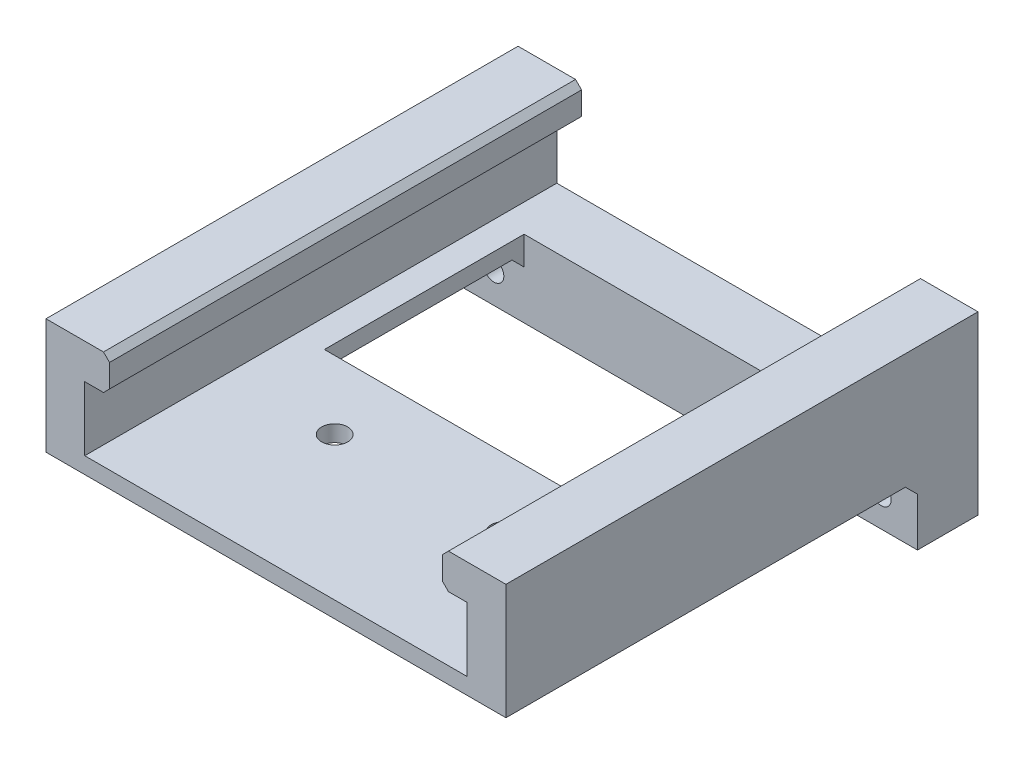
ISO-10303-21;
HEADER;
FILE_DESCRIPTION(('STEP AP214'),'2;1');
FILE_NAME('part.step','',(''),(''),'','','');
FILE_SCHEMA(('AUTOMOTIVE_DESIGN { 1 0 10303 214 1 1 1 1 }'));
ENDSEC;
DATA;
#1=APPLICATION_CONTEXT('core data for automotive mechanical design processes');
#2=APPLICATION_PROTOCOL_DEFINITION('international standard','automotive_design',2000,#1);
#3=PRODUCT_CONTEXT('',#1,'mechanical');
#4=PRODUCT('Part','Part','',(#3));
#5=PRODUCT_RELATED_PRODUCT_CATEGORY('part','',(#4));
#6=PRODUCT_DEFINITION_FORMATION('','',#4);
#7=PRODUCT_DEFINITION_CONTEXT('part definition',#1,'design');
#8=PRODUCT_DEFINITION('design','',#6,#7);
#9=PRODUCT_DEFINITION_SHAPE('','',#8);
#10=(LENGTH_UNIT() NAMED_UNIT(*) SI_UNIT(.MILLI.,.METRE.));
#11=(NAMED_UNIT(*) PLANE_ANGLE_UNIT() SI_UNIT($,.RADIAN.));
#12=(NAMED_UNIT(*) SI_UNIT($,.STERADIAN.) SOLID_ANGLE_UNIT());
#13=UNCERTAINTY_MEASURE_WITH_UNIT(LENGTH_MEASURE(1.E-05),#10,'distance_accuracy_value','');
#14=(GEOMETRIC_REPRESENTATION_CONTEXT(3) GLOBAL_UNCERTAINTY_ASSIGNED_CONTEXT((#13)) GLOBAL_UNIT_ASSIGNED_CONTEXT((#10,
#11,#12)) REPRESENTATION_CONTEXT('',''));
#15=CARTESIAN_POINT('',(0.,0.,0.));
#16=DIRECTION('',(0.,0.,1.));
#17=DIRECTION('',(1.,0.,0.));
#18=AXIS2_PLACEMENT_3D('',#15,#16,#17);
#19=CARTESIAN_POINT('',(-38.,0.,39.));
#20=DIRECTION('',(0.,1.,0.));
#21=DIRECTION('',(0.,0.,1.));
#22=AXIS2_PLACEMENT_3D('',#19,#20,#21);
#23=PLANE('',#22);
#24=CARTESIAN_POINT('',(-14.,0.,15.3));
#25=DIRECTION('',(0.,-1.,0.));
#26=DIRECTION('',(0.,0.,-1.));
#27=AXIS2_PLACEMENT_3D('',#24,#25,#26);
#28=CIRCLE('',#27,2.15);
#29=CARTESIAN_POINT('',(-14.,0.,13.15));
#30=VERTEX_POINT('',#29);
#31=EDGE_CURVE('E326',#30,#30,#28,.T.);
#32=ORIENTED_EDGE('',*,*,#31,.F.);
#33=EDGE_LOOP('',(#32));
#34=FACE_BOUND('',#33,.T.);
#35=CARTESIAN_POINT('',(14.,0.,15.3));
#36=DIRECTION('',(0.,-1.,0.));
#37=DIRECTION('',(0.,0.,-1.));
#38=AXIS2_PLACEMENT_3D('',#35,#36,#37);
#39=CIRCLE('',#38,2.15);
#40=CARTESIAN_POINT('',(14.,0.,13.15));
#41=VERTEX_POINT('',#40);
#42=EDGE_CURVE('E317',#41,#41,#39,.T.);
#43=ORIENTED_EDGE('',*,*,#42,.F.);
#44=EDGE_LOOP('',(#43));
#45=FACE_BOUND('',#44,.T.);
#46=DIRECTION('',(0.,0.,-1.));
#47=VECTOR('',#46,1.);
#48=CARTESIAN_POINT('',(-38.,0.,39.));
#49=LINE('',#48,#47);
#50=CARTESIAN_POINT('',(-38.,0.,39.));
#51=VERTEX_POINT('',#50);
#52=CARTESIAN_POINT('',(-38.,0.,-27.));
#53=VERTEX_POINT('',#52);
#54=EDGE_CURVE('E436',#51,#53,#49,.T.);
#55=ORIENTED_EDGE('',*,*,#54,.T.);
#56=DIRECTION('',(1.,0.,0.));
#57=VECTOR('',#56,1.);
#58=CARTESIAN_POINT('',(-27.,0.,-27.));
#59=LINE('',#58,#57);
#60=CARTESIAN_POINT('',(-27.,0.,-27.));
#61=VERTEX_POINT('',#60);
#62=EDGE_CURVE('E74',#53,#61,#59,.T.);
#63=ORIENTED_EDGE('',*,*,#62,.T.);
#64=DIRECTION('',(0.,0.,-1.));
#65=VECTOR('',#64,1.);
#66=CARTESIAN_POINT('',(-27.,0.,-29.));
#67=LINE('',#66,#65);
#68=CARTESIAN_POINT('',(-27.,0.,4.));
#69=VERTEX_POINT('',#68);
#70=EDGE_CURVE('E264',#69,#61,#67,.T.);
#71=ORIENTED_EDGE('',*,*,#70,.F.);
#72=DIRECTION('',(-1.,0.,0.));
#73=VECTOR('',#72,1.);
#74=CARTESIAN_POINT('',(-27.,0.,4.));
#75=LINE('',#74,#73);
#76=CARTESIAN_POINT('',(27.,0.,4.));
#77=VERTEX_POINT('',#76);
#78=EDGE_CURVE('E285',#77,#69,#75,.T.);
#79=ORIENTED_EDGE('',*,*,#78,.F.);
#80=DIRECTION('',(0.,0.,1.));
#81=VECTOR('',#80,1.);
#82=CARTESIAN_POINT('',(27.,0.,-29.));
#83=LINE('',#82,#81);
#84=CARTESIAN_POINT('',(27.,0.,-27.));
#85=VERTEX_POINT('',#84);
#86=EDGE_CURVE('E258',#85,#77,#83,.T.);
#87=ORIENTED_EDGE('',*,*,#86,.F.);
#88=DIRECTION('',(1.,0.,0.));
#89=VECTOR('',#88,1.);
#90=CARTESIAN_POINT('',(38.,0.,-27.));
#91=LINE('',#90,#89);
#92=CARTESIAN_POINT('',(38.,0.,-27.));
#93=VERTEX_POINT('',#92);
#94=EDGE_CURVE('E459',#85,#93,#91,.T.);
#95=ORIENTED_EDGE('',*,*,#94,.T.);
#96=DIRECTION('',(0.,0.,-1.));
#97=VECTOR('',#96,1.);
#98=CARTESIAN_POINT('',(38.,0.,39.));
#99=LINE('',#98,#97);
#100=CARTESIAN_POINT('',(38.,0.,39.));
#101=VERTEX_POINT('',#100);
#102=EDGE_CURVE('E426',#101,#93,#99,.T.);
#103=ORIENTED_EDGE('',*,*,#102,.F.);
#104=DIRECTION('',(1.,0.,0.));
#105=VECTOR('',#104,1.);
#106=CARTESIAN_POINT('',(-38.,0.,39.));
#107=LINE('',#106,#105);
#108=EDGE_CURVE('E344',#51,#101,#107,.T.);
#109=ORIENTED_EDGE('',*,*,#108,.F.);
#110=EDGE_LOOP('',(#55,#63,#71,#79,#87,#95,#103,#109));
#111=FACE_BOUND('',#110,.T.);
#112=ADVANCED_FACE('F55',(#34,#45,#111),#23,.F.);
#113=CARTESIAN_POINT('',(-27.5,19.1,39.));
#114=DIRECTION('',(-1.,0.,0.));
#115=DIRECTION('',(0.,-1.,0.));
#116=AXIS2_PLACEMENT_3D('',#113,#114,#115);
#117=PLANE('',#116);
#118=DIRECTION('',(0.,1.,0.));
#119=VECTOR('',#118,1.);
#120=CARTESIAN_POINT('',(-27.5,19.1,-39.));
#121=LINE('',#120,#119);
#122=CARTESIAN_POINT('',(-27.5,14.3,-39.));
#123=VERTEX_POINT('',#122);
#124=CARTESIAN_POINT('',(-27.5,18.1,-39.));
#125=VERTEX_POINT('',#124);
#126=EDGE_CURVE('E334',#123,#125,#121,.T.);
#127=ORIENTED_EDGE('',*,*,#126,.T.);
#128=DIRECTION('',(0.,0.,1.));
#129=VECTOR('',#128,1.);
#130=CARTESIAN_POINT('',(-27.5,18.1,39.));
#131=LINE('',#130,#129);
#132=CARTESIAN_POINT('',(-27.5,18.1,39.));
#133=VERTEX_POINT('',#132);
#134=EDGE_CURVE('E536',#125,#133,#131,.T.);
#135=ORIENTED_EDGE('',*,*,#134,.T.);
#136=DIRECTION('',(0.,1.,0.));
#137=VECTOR('',#136,1.);
#138=CARTESIAN_POINT('',(-27.5,19.1,39.));
#139=LINE('',#138,#137);
#140=CARTESIAN_POINT('',(-27.5,14.3,39.));
#141=VERTEX_POINT('',#140);
#142=EDGE_CURVE('E335',#141,#133,#139,.T.);
#143=ORIENTED_EDGE('',*,*,#142,.F.);
#144=DIRECTION('',(0.,0.,-1.));
#145=VECTOR('',#144,1.);
#146=CARTESIAN_POINT('',(-27.5,14.3,39.));
#147=LINE('',#146,#145);
#148=EDGE_CURVE('E534',#141,#123,#147,.T.);
#149=ORIENTED_EDGE('',*,*,#148,.T.);
#150=EDGE_LOOP('',(#127,#135,#143,#149));
#151=FACE_BOUND('',#150,.T.);
#152=ADVANCED_FACE('F556',(#151),#117,.F.);
#153=CARTESIAN_POINT('',(-27.5,19.1,39.));
#154=DIRECTION('',(0.,-1.,0.));
#155=DIRECTION('',(0.,0.,-1.));
#156=AXIS2_PLACEMENT_3D('',#153,#154,#155);
#157=PLANE('',#156);
#158=DIRECTION('',(-1.,0.,0.));
#159=VECTOR('',#158,1.);
#160=CARTESIAN_POINT('',(-27.5,19.1,39.));
#161=LINE('',#160,#159);
#162=CARTESIAN_POINT('',(-28.5,19.1,39.));
#163=VERTEX_POINT('',#162);
#164=CARTESIAN_POINT('',(-38.,19.1,39.));
#165=VERTEX_POINT('',#164);
#166=EDGE_CURVE('E338',#163,#165,#161,.T.);
#167=ORIENTED_EDGE('',*,*,#166,.F.);
#168=DIRECTION('',(0.,0.,-1.));
#169=VECTOR('',#168,1.);
#170=CARTESIAN_POINT('',(-28.5,19.1,39.));
#171=LINE('',#170,#169);
#172=CARTESIAN_POINT('',(-28.5,19.1,-39.));
#173=VERTEX_POINT('',#172);
#174=EDGE_CURVE('E530',#163,#173,#171,.T.);
#175=ORIENTED_EDGE('',*,*,#174,.T.);
#176=DIRECTION('',(-1.,0.,0.));
#177=VECTOR('',#176,1.);
#178=CARTESIAN_POINT('',(-27.5,19.1,-39.));
#179=LINE('',#178,#177);
#180=CARTESIAN_POINT('',(-38.,19.1,-39.));
#181=VERTEX_POINT('',#180);
#182=EDGE_CURVE('E375',#173,#181,#179,.T.);
#183=ORIENTED_EDGE('',*,*,#182,.T.);
#184=DIRECTION('',(0.,0.,-1.));
#185=VECTOR('',#184,1.);
#186=CARTESIAN_POINT('',(-38.,19.1,39.));
#187=LINE('',#186,#185);
#188=EDGE_CURVE('E441',#165,#181,#187,.T.);
#189=ORIENTED_EDGE('',*,*,#188,.F.);
#190=EDGE_LOOP('',(#167,#175,#183,#189));
#191=FACE_BOUND('',#190,.T.);
#192=ADVANCED_FACE('F565',(#191),#157,.F.);
#193=CARTESIAN_POINT('',(-38.,19.1,39.));
#194=DIRECTION('',(1.,0.,0.));
#195=DIRECTION('',(0.,0.,-1.));
#196=AXIS2_PLACEMENT_3D('',#193,#194,#195);
#197=PLANE('',#196);
#198=DIRECTION('',(0.,-1.,0.));
#199=VECTOR('',#198,1.);
#200=CARTESIAN_POINT('',(-38.,19.1,-39.));
#201=LINE('',#200,#199);
#202=CARTESIAN_POINT('',(-38.,-10.,-39.));
#203=VERTEX_POINT('',#202);
#204=EDGE_CURVE('E378',#181,#203,#201,.T.);
#205=ORIENTED_EDGE('',*,*,#204,.T.);
#206=DIRECTION('',(0.,0.,-1.));
#207=VECTOR('',#206,1.);
#208=CARTESIAN_POINT('',(-38.,-10.,-29.));
#209=LINE('',#208,#207);
#210=CARTESIAN_POINT('',(-38.,-10.,-29.));
#211=VERTEX_POINT('',#210);
#212=EDGE_CURVE('E309',#211,#203,#209,.T.);
#213=ORIENTED_EDGE('',*,*,#212,.F.);
#214=DIRECTION('',(0.,1.,0.));
#215=VECTOR('',#214,1.);
#216=CARTESIAN_POINT('',(-38.,-10.,-29.));
#217=LINE('',#216,#215);
#218=CARTESIAN_POINT('',(-38.,-2.00000000000002,-29.));
#219=VERTEX_POINT('',#218);
#220=EDGE_CURVE('E316',#211,#219,#217,.T.);
#221=ORIENTED_EDGE('',*,*,#220,.T.);
#222=DIRECTION('',(0.,-0.707106781186551,-0.707106781186544));
#223=VECTOR('',#222,1.);
#224=CARTESIAN_POINT('',(-38.,42.5500000000001,15.5499999999997));
#225=LINE('',#224,#223);
#226=EDGE_CURVE('E83',#219,#53,#225,.F.);
#227=ORIENTED_EDGE('',*,*,#226,.T.);
#228=ORIENTED_EDGE('',*,*,#54,.F.);
#229=DIRECTION('',(0.,-1.,0.));
#230=VECTOR('',#229,1.);
#231=CARTESIAN_POINT('',(-38.,19.1,39.));
#232=LINE('',#231,#230);
#233=EDGE_CURVE('E341',#165,#51,#232,.T.);
#234=ORIENTED_EDGE('',*,*,#233,.F.);
#235=ORIENTED_EDGE('',*,*,#188,.T.);
#236=EDGE_LOOP('',(#205,#213,#221,#227,#228,#234,#235));
#237=FACE_BOUND('',#236,.T.);
#238=ADVANCED_FACE('F570',(#237),#197,.F.);
#239=CARTESIAN_POINT('',(38.,19.1,39.));
#240=DIRECTION('',(-1.,0.,0.));
#241=DIRECTION('',(0.,0.,1.));
#242=AXIS2_PLACEMENT_3D('',#239,#240,#241);
#243=PLANE('',#242);
#244=DIRECTION('',(0.,1.,0.));
#245=VECTOR('',#244,1.);
#246=CARTESIAN_POINT('',(38.,19.1,-39.));
#247=LINE('',#246,#245);
#248=CARTESIAN_POINT('',(38.,-10.,-39.));
#249=VERTEX_POINT('',#248);
#250=CARTESIAN_POINT('',(38.,19.1,-39.));
#251=VERTEX_POINT('',#250);
#252=EDGE_CURVE('E381',#249,#251,#247,.T.);
#253=ORIENTED_EDGE('',*,*,#252,.T.);
#254=DIRECTION('',(0.,0.,-1.));
#255=VECTOR('',#254,1.);
#256=CARTESIAN_POINT('',(38.,19.1,39.));
#257=LINE('',#256,#255);
#258=CARTESIAN_POINT('',(38.,19.1,39.));
#259=VERTEX_POINT('',#258);
#260=EDGE_CURVE('E422',#259,#251,#257,.T.);
#261=ORIENTED_EDGE('',*,*,#260,.F.);
#262=DIRECTION('',(0.,1.,0.));
#263=VECTOR('',#262,1.);
#264=CARTESIAN_POINT('',(38.,19.1,39.));
#265=LINE('',#264,#263);
#266=EDGE_CURVE('E347',#101,#259,#265,.T.);
#267=ORIENTED_EDGE('',*,*,#266,.F.);
#268=ORIENTED_EDGE('',*,*,#102,.T.);
#269=DIRECTION('',(0.,0.707106781186551,0.707106781186544));
#270=VECTOR('',#269,1.);
#271=CARTESIAN_POINT('',(38.,42.5500000000001,15.5499999999997));
#272=LINE('',#271,#270);
#273=CARTESIAN_POINT('',(38.,-2.00000000000002,-29.));
#274=VERTEX_POINT('',#273);
#275=EDGE_CURVE('E13',#93,#274,#272,.F.);
#276=ORIENTED_EDGE('',*,*,#275,.T.);
#277=DIRECTION('',(0.,1.,0.));
#278=VECTOR('',#277,1.);
#279=CARTESIAN_POINT('',(38.,-10.,-29.));
#280=LINE('',#279,#278);
#281=CARTESIAN_POINT('',(38.,-10.,-29.));
#282=VERTEX_POINT('',#281);
#283=EDGE_CURVE('E322',#282,#274,#280,.T.);
#284=ORIENTED_EDGE('',*,*,#283,.F.);
#285=DIRECTION('',(0.,0.,1.));
#286=VECTOR('',#285,1.);
#287=CARTESIAN_POINT('',(38.,-10.,-29.));
#288=LINE('',#287,#286);
#289=EDGE_CURVE('E273',#249,#282,#288,.T.);
#290=ORIENTED_EDGE('',*,*,#289,.F.);
#291=EDGE_LOOP('',(#253,#261,#267,#268,#276,#284,#290));
#292=FACE_BOUND('',#291,.T.);
#293=ADVANCED_FACE('F477',(#292),#243,.F.);
#294=CARTESIAN_POINT('',(27.5,19.1,39.));
#295=DIRECTION('',(0.,-1.,0.));
#296=DIRECTION('',(0.,0.,-1.));
#297=AXIS2_PLACEMENT_3D('',#294,#295,#296);
#298=PLANE('',#297);
#299=DIRECTION('',(-1.,0.,0.));
#300=VECTOR('',#299,1.);
#301=CARTESIAN_POINT('',(27.5,19.1,-39.));
#302=LINE('',#301,#300);
#303=CARTESIAN_POINT('',(28.5,19.1,-39.));
#304=VERTEX_POINT('',#303);
#305=EDGE_CURVE('E384',#251,#304,#302,.T.);
#306=ORIENTED_EDGE('',*,*,#305,.T.);
#307=DIRECTION('',(0.,0.,1.));
#308=VECTOR('',#307,1.);
#309=CARTESIAN_POINT('',(28.5,19.1,39.));
#310=LINE('',#309,#308);
#311=CARTESIAN_POINT('',(28.5,19.1,39.));
#312=VERTEX_POINT('',#311);
#313=EDGE_CURVE('E527',#304,#312,#310,.T.);
#314=ORIENTED_EDGE('',*,*,#313,.T.);
#315=DIRECTION('',(-1.,0.,0.));
#316=VECTOR('',#315,1.);
#317=CARTESIAN_POINT('',(27.5,19.1,39.));
#318=LINE('',#317,#316);
#319=EDGE_CURVE('E350',#259,#312,#318,.T.);
#320=ORIENTED_EDGE('',*,*,#319,.F.);
#321=ORIENTED_EDGE('',*,*,#260,.T.);
#322=EDGE_LOOP('',(#306,#314,#320,#321));
#323=FACE_BOUND('',#322,.T.);
#324=ADVANCED_FACE('F492',(#323),#298,.F.);
#325=CARTESIAN_POINT('',(27.5,19.1,39.));
#326=DIRECTION('',(1.,0.,0.));
#327=DIRECTION('',(0.,1.,0.));
#328=AXIS2_PLACEMENT_3D('',#325,#326,#327);
#329=PLANE('',#328);
#330=DIRECTION('',(0.,-1.,0.));
#331=VECTOR('',#330,1.);
#332=CARTESIAN_POINT('',(27.5,19.1,-39.));
#333=LINE('',#332,#331);
#334=CARTESIAN_POINT('',(27.5,18.1,-39.));
#335=VERTEX_POINT('',#334);
#336=CARTESIAN_POINT('',(27.5,14.3,-39.));
#337=VERTEX_POINT('',#336);
#338=EDGE_CURVE('E388',#335,#337,#333,.T.);
#339=ORIENTED_EDGE('',*,*,#338,.T.);
#340=DIRECTION('',(0.,0.,1.));
#341=VECTOR('',#340,1.);
#342=CARTESIAN_POINT('',(27.5,14.3,39.));
#343=LINE('',#342,#341);
#344=CARTESIAN_POINT('',(27.5,14.3,39.));
#345=VERTEX_POINT('',#344);
#346=EDGE_CURVE('E515',#337,#345,#343,.T.);
#347=ORIENTED_EDGE('',*,*,#346,.T.);
#348=DIRECTION('',(0.,-1.,0.));
#349=VECTOR('',#348,1.);
#350=CARTESIAN_POINT('',(27.5,19.1,39.));
#351=LINE('',#350,#349);
#352=CARTESIAN_POINT('',(27.5,18.1,39.));
#353=VERTEX_POINT('',#352);
#354=EDGE_CURVE('E353',#353,#345,#351,.T.);
#355=ORIENTED_EDGE('',*,*,#354,.F.);
#356=DIRECTION('',(0.,0.,-1.));
#357=VECTOR('',#356,1.);
#358=CARTESIAN_POINT('',(27.5,18.1,39.));
#359=LINE('',#358,#357);
#360=EDGE_CURVE('E506',#353,#335,#359,.T.);
#361=ORIENTED_EDGE('',*,*,#360,.T.);
#362=EDGE_LOOP('',(#339,#347,#355,#361));
#363=FACE_BOUND('',#362,.T.);
#364=ADVANCED_FACE('F575',(#363),#329,.F.);
#365=CARTESIAN_POINT('',(27.5,13.3,39.));
#366=DIRECTION('',(0.,1.,0.));
#367=DIRECTION('',(0.,0.,1.));
#368=AXIS2_PLACEMENT_3D('',#365,#366,#367);
#369=PLANE('',#368);
#370=DIRECTION('',(1.,0.,0.));
#371=VECTOR('',#370,1.);
#372=CARTESIAN_POINT('',(27.5,13.3,39.));
#373=LINE('',#372,#371);
#374=CARTESIAN_POINT('',(28.5,13.3,39.));
#375=VERTEX_POINT('',#374);
#376=CARTESIAN_POINT('',(31.6,13.3,39.));
#377=VERTEX_POINT('',#376);
#378=EDGE_CURVE('E357',#375,#377,#373,.T.);
#379=ORIENTED_EDGE('',*,*,#378,.F.);
#380=DIRECTION('',(0.,0.,-1.));
#381=VECTOR('',#380,1.);
#382=CARTESIAN_POINT('',(28.5,13.3,39.));
#383=LINE('',#382,#381);
#384=CARTESIAN_POINT('',(28.5,13.3,-39.));
#385=VERTEX_POINT('',#384);
#386=EDGE_CURVE('E583',#375,#385,#383,.T.);
#387=ORIENTED_EDGE('',*,*,#386,.T.);
#388=DIRECTION('',(1.,0.,0.));
#389=VECTOR('',#388,1.);
#390=CARTESIAN_POINT('',(27.5,13.3,-39.));
#391=LINE('',#390,#389);
#392=CARTESIAN_POINT('',(31.6,13.3,-39.));
#393=VERTEX_POINT('',#392);
#394=EDGE_CURVE('E392',#385,#393,#391,.T.);
#395=ORIENTED_EDGE('',*,*,#394,.T.);
#396=DIRECTION('',(0.,0.,-1.));
#397=VECTOR('',#396,1.);
#398=CARTESIAN_POINT('',(31.6,13.3,39.));
#399=LINE('',#398,#397);
#400=EDGE_CURVE('E418',#377,#393,#399,.T.);
#401=ORIENTED_EDGE('',*,*,#400,.F.);
#402=EDGE_LOOP('',(#379,#387,#395,#401));
#403=FACE_BOUND('',#402,.T.);
#404=ADVANCED_FACE('F691',(#403),#369,.F.);
#405=CARTESIAN_POINT('',(31.6,13.3,39.));
#406=DIRECTION('',(1.,0.,0.));
#407=DIRECTION('',(0.,1.,0.));
#408=AXIS2_PLACEMENT_3D('',#405,#406,#407);
#409=PLANE('',#408);
#410=DIRECTION('',(0.,-1.,0.));
#411=VECTOR('',#410,1.);
#412=CARTESIAN_POINT('',(31.6,13.3,-39.));
#413=LINE('',#412,#411);
#414=CARTESIAN_POINT('',(31.6,2.7,-39.));
#415=VERTEX_POINT('',#414);
#416=EDGE_CURVE('E395',#393,#415,#413,.T.);
#417=ORIENTED_EDGE('',*,*,#416,.T.);
#418=DIRECTION('',(0.,0.,-1.));
#419=VECTOR('',#418,1.);
#420=CARTESIAN_POINT('',(31.6,2.7,39.));
#421=LINE('',#420,#419);
#422=CARTESIAN_POINT('',(31.6,2.7,39.));
#423=VERTEX_POINT('',#422);
#424=EDGE_CURVE('E414',#423,#415,#421,.T.);
#425=ORIENTED_EDGE('',*,*,#424,.F.);
#426=DIRECTION('',(0.,-1.,0.));
#427=VECTOR('',#426,1.);
#428=CARTESIAN_POINT('',(31.6,13.3,39.));
#429=LINE('',#428,#427);
#430=EDGE_CURVE('E360',#377,#423,#429,.T.);
#431=ORIENTED_EDGE('',*,*,#430,.F.);
#432=ORIENTED_EDGE('',*,*,#400,.T.);
#433=EDGE_LOOP('',(#417,#425,#431,#432));
#434=FACE_BOUND('',#433,.T.);
#435=ADVANCED_FACE('F688',(#434),#409,.F.);
#436=CARTESIAN_POINT('',(-31.6,2.7,39.));
#437=DIRECTION('',(0.,-1.,0.));
#438=DIRECTION('',(0.,0.,-1.));
#439=AXIS2_PLACEMENT_3D('',#436,#437,#438);
#440=PLANE('',#439);
#441=DIRECTION('',(-1.,0.,0.));
#442=VECTOR('',#441,1.);
#443=CARTESIAN_POINT('',(-27.,2.7,-29.));
#444=LINE('',#443,#442);
#445=CARTESIAN_POINT('',(27.,2.70000000000001,-29.));
#446=VERTEX_POINT('',#445);
#447=CARTESIAN_POINT('',(-27.,2.70000000000001,-29.));
#448=VERTEX_POINT('',#447);
#449=EDGE_CURVE('E279',#446,#448,#444,.T.);
#450=ORIENTED_EDGE('',*,*,#449,.F.);
#451=DIRECTION('',(0.,0.,-1.));
#452=VECTOR('',#451,1.);
#453=CARTESIAN_POINT('',(27.,2.7,-29.));
#454=LINE('',#453,#452);
#455=CARTESIAN_POINT('',(27.,2.7,4.));
#456=VERTEX_POINT('',#455);
#457=EDGE_CURVE('E255',#456,#446,#454,.T.);
#458=ORIENTED_EDGE('',*,*,#457,.F.);
#459=DIRECTION('',(1.,0.,0.));
#460=VECTOR('',#459,1.);
#461=CARTESIAN_POINT('',(-27.,2.7,4.));
#462=LINE('',#461,#460);
#463=CARTESIAN_POINT('',(-27.,2.7,4.));
#464=VERTEX_POINT('',#463);
#465=EDGE_CURVE('E268',#464,#456,#462,.T.);
#466=ORIENTED_EDGE('',*,*,#465,.F.);
#467=DIRECTION('',(0.,0.,1.));
#468=VECTOR('',#467,1.);
#469=CARTESIAN_POINT('',(-27.,2.7,-29.));
#470=LINE('',#469,#468);
#471=EDGE_CURVE('E288',#448,#464,#470,.T.);
#472=ORIENTED_EDGE('',*,*,#471,.F.);
#473=EDGE_LOOP('',(#450,#458,#466,#472));
#474=FACE_BOUND('',#473,.T.);
#475=CARTESIAN_POINT('',(14.,2.7,15.3));
#476=DIRECTION('',(0.,-1.,0.));
#477=DIRECTION('',(0.,0.,-1.));
#478=AXIS2_PLACEMENT_3D('',#475,#476,#477);
#479=CIRCLE('',#478,2.15);
#480=CARTESIAN_POINT('',(14.,2.7,13.15));
#481=VERTEX_POINT('',#480);
#482=EDGE_CURVE('E321',#481,#481,#479,.T.);
#483=ORIENTED_EDGE('',*,*,#482,.T.);
#484=EDGE_LOOP('',(#483));
#485=FACE_BOUND('',#484,.T.);
#486=CARTESIAN_POINT('',(-14.,2.7,15.3));
#487=DIRECTION('',(0.,-1.,0.));
#488=DIRECTION('',(0.,0.,-1.));
#489=AXIS2_PLACEMENT_3D('',#486,#487,#488);
#490=CIRCLE('',#489,2.15);
#491=CARTESIAN_POINT('',(-14.,2.7,13.15));
#492=VERTEX_POINT('',#491);
#493=EDGE_CURVE('E330',#492,#492,#490,.T.);
#494=ORIENTED_EDGE('',*,*,#493,.T.);
#495=EDGE_LOOP('',(#494));
#496=FACE_BOUND('',#495,.T.);
#497=DIRECTION('',(-1.,0.,0.));
#498=VECTOR('',#497,1.);
#499=CARTESIAN_POINT('',(-31.6,2.7,-39.));
#500=LINE('',#499,#498);
#501=CARTESIAN_POINT('',(-31.6,2.7,-39.));
#502=VERTEX_POINT('',#501);
#503=EDGE_CURVE('E398',#415,#502,#500,.T.);
#504=ORIENTED_EDGE('',*,*,#503,.T.);
#505=DIRECTION('',(0.,0.,-1.));
#506=VECTOR('',#505,1.);
#507=CARTESIAN_POINT('',(-31.6,2.7,39.));
#508=LINE('',#507,#506);
#509=CARTESIAN_POINT('',(-31.6,2.7,39.));
#510=VERTEX_POINT('',#509);
#511=EDGE_CURVE('E410',#510,#502,#508,.T.);
#512=ORIENTED_EDGE('',*,*,#511,.F.);
#513=DIRECTION('',(-1.,0.,0.));
#514=VECTOR('',#513,1.);
#515=CARTESIAN_POINT('',(-31.6,2.7,39.));
#516=LINE('',#515,#514);
#517=EDGE_CURVE('E363',#423,#510,#516,.T.);
#518=ORIENTED_EDGE('',*,*,#517,.F.);
#519=ORIENTED_EDGE('',*,*,#424,.T.);
#520=EDGE_LOOP('',(#504,#512,#518,#519));
#521=FACE_BOUND('',#520,.T.);
#522=ADVANCED_FACE('F276',(#474,#485,#496,#521),#440,.F.);
#523=CARTESIAN_POINT('',(-31.6,13.3,39.));
#524=DIRECTION('',(-1.,0.,0.));
#525=DIRECTION('',(0.,-1.,0.));
#526=AXIS2_PLACEMENT_3D('',#523,#524,#525);
#527=PLANE('',#526);
#528=DIRECTION('',(0.,1.,0.));
#529=VECTOR('',#528,1.);
#530=CARTESIAN_POINT('',(-31.6,13.3,-39.));
#531=LINE('',#530,#529);
#532=CARTESIAN_POINT('',(-31.6,13.3,-39.));
#533=VERTEX_POINT('',#532);
#534=EDGE_CURVE('E401',#502,#533,#531,.T.);
#535=ORIENTED_EDGE('',*,*,#534,.T.);
#536=DIRECTION('',(0.,0.,-1.));
#537=VECTOR('',#536,1.);
#538=CARTESIAN_POINT('',(-31.6,13.3,39.));
#539=LINE('',#538,#537);
#540=CARTESIAN_POINT('',(-31.6,13.3,39.));
#541=VERTEX_POINT('',#540);
#542=EDGE_CURVE('E371',#541,#533,#539,.T.);
#543=ORIENTED_EDGE('',*,*,#542,.F.);
#544=DIRECTION('',(0.,1.,0.));
#545=VECTOR('',#544,1.);
#546=CARTESIAN_POINT('',(-31.6,13.3,39.));
#547=LINE('',#546,#545);
#548=EDGE_CURVE('E366',#510,#541,#547,.T.);
#549=ORIENTED_EDGE('',*,*,#548,.F.);
#550=ORIENTED_EDGE('',*,*,#511,.T.);
#551=EDGE_LOOP('',(#535,#543,#549,#550));
#552=FACE_BOUND('',#551,.T.);
#553=ADVANCED_FACE('F682',(#552),#527,.F.);
#554=CARTESIAN_POINT('',(-27.5,13.3,39.));
#555=DIRECTION('',(0.,1.,0.));
#556=DIRECTION('',(0.,0.,1.));
#557=AXIS2_PLACEMENT_3D('',#554,#555,#556);
#558=PLANE('',#557);
#559=DIRECTION('',(1.,0.,0.));
#560=VECTOR('',#559,1.);
#561=CARTESIAN_POINT('',(-27.5,13.3,-39.));
#562=LINE('',#561,#560);
#563=CARTESIAN_POINT('',(-28.5,13.3,-39.));
#564=VERTEX_POINT('',#563);
#565=EDGE_CURVE('E339',#533,#564,#562,.T.);
#566=ORIENTED_EDGE('',*,*,#565,.T.);
#567=DIRECTION('',(0.,0.,1.));
#568=VECTOR('',#567,1.);
#569=CARTESIAN_POINT('',(-28.5,13.3,39.));
#570=LINE('',#569,#568);
#571=CARTESIAN_POINT('',(-28.5,13.3,39.));
#572=VERTEX_POINT('',#571);
#573=EDGE_CURVE('E437',#564,#572,#570,.T.);
#574=ORIENTED_EDGE('',*,*,#573,.T.);
#575=DIRECTION('',(1.,0.,0.));
#576=VECTOR('',#575,1.);
#577=CARTESIAN_POINT('',(-27.5,13.3,39.));
#578=LINE('',#577,#576);
#579=EDGE_CURVE('E368',#541,#572,#578,.T.);
#580=ORIENTED_EDGE('',*,*,#579,.F.);
#581=ORIENTED_EDGE('',*,*,#542,.T.);
#582=EDGE_LOOP('',(#566,#574,#580,#581));
#583=FACE_BOUND('',#582,.T.);
#584=ADVANCED_FACE('F545',(#583),#558,.F.);
#585=CARTESIAN_POINT('',(0.,0.,39.));
#586=DIRECTION('',(0.,0.,-1.));
#587=DIRECTION('',(-1.,0.,0.));
#588=AXIS2_PLACEMENT_3D('',#585,#586,#587);
#589=PLANE('',#588);
#590=ORIENTED_EDGE('',*,*,#354,.T.);
#591=DIRECTION('',(-0.707106781186548,0.707106781186548,0.));
#592=VECTOR('',#591,1.);
#593=CARTESIAN_POINT('',(28.5,13.3,39.));
#594=LINE('',#593,#592);
#595=EDGE_CURVE('E524',#345,#375,#594,.F.);
#596=ORIENTED_EDGE('',*,*,#595,.T.);
#597=ORIENTED_EDGE('',*,*,#378,.T.);
#598=ORIENTED_EDGE('',*,*,#430,.T.);
#599=ORIENTED_EDGE('',*,*,#517,.T.);
#600=ORIENTED_EDGE('',*,*,#548,.T.);
#601=ORIENTED_EDGE('',*,*,#579,.T.);
#602=DIRECTION('',(-0.707106781186543,-0.707106781186552,0.));
#603=VECTOR('',#602,1.);
#604=CARTESIAN_POINT('',(-27.5,14.3,39.));
#605=LINE('',#604,#603);
#606=EDGE_CURVE('E518',#572,#141,#605,.F.);
#607=ORIENTED_EDGE('',*,*,#606,.T.);
#608=ORIENTED_EDGE('',*,*,#142,.T.);
#609=DIRECTION('',(0.707106781186552,-0.707106781186543,0.));
#610=VECTOR('',#609,1.);
#611=CARTESIAN_POINT('',(-28.5,19.1,39.));
#612=LINE('',#611,#610);
#613=EDGE_CURVE('E520',#133,#163,#612,.F.);
#614=ORIENTED_EDGE('',*,*,#613,.T.);
#615=ORIENTED_EDGE('',*,*,#166,.T.);
#616=ORIENTED_EDGE('',*,*,#233,.T.);
#617=ORIENTED_EDGE('',*,*,#108,.T.);
#618=ORIENTED_EDGE('',*,*,#266,.T.);
#619=ORIENTED_EDGE('',*,*,#319,.T.);
#620=DIRECTION('',(0.707106781186548,0.707106781186548,0.));
#621=VECTOR('',#620,1.);
#622=CARTESIAN_POINT('',(27.5,18.1,39.));
#623=LINE('',#622,#621);
#624=EDGE_CURVE('E522',#312,#353,#623,.F.);
#625=ORIENTED_EDGE('',*,*,#624,.T.);
#626=EDGE_LOOP('',(#590,#596,#597,#598,#599,#600,#601,#607,#608,#614,#615,#616,#617,#618,#619,#625));
#627=FACE_BOUND('',#626,.T.);
#628=ADVANCED_FACE('F550',(#627),#589,.F.);
#629=CARTESIAN_POINT('',(0.,0.,-39.));
#630=DIRECTION('',(0.,0.,-1.));
#631=DIRECTION('',(-1.,0.,0.));
#632=AXIS2_PLACEMENT_3D('',#629,#630,#631);
#633=PLANE('',#632);
#634=CARTESIAN_POINT('',(-32.,-5.,-39.));
#635=DIRECTION('',(0.,0.,-1.));
#636=DIRECTION('',(-1.,0.,0.));
#637=AXIS2_PLACEMENT_3D('',#634,#635,#636);
#638=CIRCLE('',#637,1.65);
#639=CARTESIAN_POINT('',(-33.65,-5.,-39.));
#640=VERTEX_POINT('',#639);
#641=EDGE_CURVE('E593',#640,#640,#638,.T.);
#642=ORIENTED_EDGE('',*,*,#641,.F.);
#643=EDGE_LOOP('',(#642));
#644=FACE_BOUND('',#643,.T.);
#645=CARTESIAN_POINT('',(32.,-5.,-39.));
#646=DIRECTION('',(0.,0.,-1.));
#647=DIRECTION('',(-1.,0.,0.));
#648=AXIS2_PLACEMENT_3D('',#645,#646,#647);
#649=CIRCLE('',#648,1.65);
#650=CARTESIAN_POINT('',(30.35,-5.,-39.));
#651=VERTEX_POINT('',#650);
#652=EDGE_CURVE('E592',#651,#651,#649,.T.);
#653=ORIENTED_EDGE('',*,*,#652,.F.);
#654=EDGE_LOOP('',(#653));
#655=FACE_BOUND('',#654,.T.);
#656=ORIENTED_EDGE('',*,*,#394,.F.);
#657=DIRECTION('',(0.707106781186548,-0.707106781186548,0.));
#658=VECTOR('',#657,1.);
#659=CARTESIAN_POINT('',(20.9,20.9,-39.));
#660=LINE('',#659,#658);
#661=EDGE_CURVE('E502',#385,#337,#660,.F.);
#662=ORIENTED_EDGE('',*,*,#661,.T.);
#663=ORIENTED_EDGE('',*,*,#338,.F.);
#664=DIRECTION('',(-0.707106781186548,-0.707106781186548,0.));
#665=VECTOR('',#664,1.);
#666=CARTESIAN_POINT('',(4.70000000000001,-4.70000000000001,-39.));
#667=LINE('',#666,#665);
#668=EDGE_CURVE('E497',#335,#304,#667,.F.);
#669=ORIENTED_EDGE('',*,*,#668,.T.);
#670=ORIENTED_EDGE('',*,*,#305,.F.);
#671=ORIENTED_EDGE('',*,*,#252,.F.);
#672=DIRECTION('',(1.,0.,0.));
#673=VECTOR('',#672,1.);
#674=CARTESIAN_POINT('',(-38.,-10.,-39.));
#675=LINE('',#674,#673);
#676=EDGE_CURVE('E313',#203,#249,#675,.T.);
#677=ORIENTED_EDGE('',*,*,#676,.F.);
#678=ORIENTED_EDGE('',*,*,#204,.F.);
#679=ORIENTED_EDGE('',*,*,#182,.F.);
#680=DIRECTION('',(-0.707106781186552,0.707106781186543,0.));
#681=VECTOR('',#680,1.);
#682=CARTESIAN_POINT('',(-4.69999999999981,-4.69999999999987,-39.));
#683=LINE('',#682,#681);
#684=EDGE_CURVE('E503',#173,#125,#683,.F.);
#685=ORIENTED_EDGE('',*,*,#684,.T.);
#686=ORIENTED_EDGE('',*,*,#126,.F.);
#687=DIRECTION('',(0.707106781186543,0.707106781186552,0.));
#688=VECTOR('',#687,1.);
#689=CARTESIAN_POINT('',(-20.9000000000002,20.8999999999999,-39.));
#690=LINE('',#689,#688);
#691=EDGE_CURVE('E509',#123,#564,#690,.F.);
#692=ORIENTED_EDGE('',*,*,#691,.T.);
#693=ORIENTED_EDGE('',*,*,#565,.F.);
#694=ORIENTED_EDGE('',*,*,#534,.F.);
#695=ORIENTED_EDGE('',*,*,#503,.F.);
#696=ORIENTED_EDGE('',*,*,#416,.F.);
#697=EDGE_LOOP('',(#656,#662,#663,#669,#670,#671,#677,#678,#679,#685,#686,#692,#693,#694,#695,#696));
#698=FACE_BOUND('',#697,.T.);
#699=ADVANCED_FACE('F495',(#644,#655,#698),#633,.T.);
#700=CARTESIAN_POINT('',(-14.,0.,15.3));
#701=DIRECTION('',(0.,-1.,0.));
#702=DIRECTION('',(0.,0.,-1.));
#703=AXIS2_PLACEMENT_3D('',#700,#701,#702);
#704=CYLINDRICAL_SURFACE('',#703,2.15);
#705=ORIENTED_EDGE('',*,*,#493,.F.);
#706=EDGE_LOOP('',(#705));
#707=FACE_BOUND('',#706,.T.);
#708=ORIENTED_EDGE('',*,*,#31,.T.);
#709=EDGE_LOOP('',(#708));
#710=FACE_BOUND('',#709,.T.);
#711=ADVANCED_FACE('F611',(#707,#710),#704,.F.);
#712=CARTESIAN_POINT('',(14.,0.,15.3));
#713=DIRECTION('',(0.,-1.,0.));
#714=DIRECTION('',(0.,0.,-1.));
#715=AXIS2_PLACEMENT_3D('',#712,#713,#714);
#716=CYLINDRICAL_SURFACE('',#715,2.15);
#717=ORIENTED_EDGE('',*,*,#482,.F.);
#718=EDGE_LOOP('',(#717));
#719=FACE_BOUND('',#718,.T.);
#720=ORIENTED_EDGE('',*,*,#42,.T.);
#721=EDGE_LOOP('',(#720));
#722=FACE_BOUND('',#721,.T.);
#723=ADVANCED_FACE('F646',(#719,#722),#716,.F.);
#724=CARTESIAN_POINT('',(28.5,13.3,39.));
#725=DIRECTION('',(0.707106781186547,0.707106781186547,0.));
#726=DIRECTION('',(0.,0.,-1.));
#727=AXIS2_PLACEMENT_3D('',#724,#725,#726);
#728=PLANE('',#727);
#729=ORIENTED_EDGE('',*,*,#595,.F.);
#730=ORIENTED_EDGE('',*,*,#346,.F.);
#731=ORIENTED_EDGE('',*,*,#661,.F.);
#732=ORIENTED_EDGE('',*,*,#386,.F.);
#733=EDGE_LOOP('',(#729,#730,#731,#732));
#734=FACE_BOUND('',#733,.T.);
#735=ADVANCED_FACE('F581',(#734),#728,.F.);
#736=CARTESIAN_POINT('',(27.5,18.1,39.));
#737=DIRECTION('',(0.707106781186548,-0.707106781186548,0.));
#738=DIRECTION('',(0.,0.,-1.));
#739=AXIS2_PLACEMENT_3D('',#736,#737,#738);
#740=PLANE('',#739);
#741=ORIENTED_EDGE('',*,*,#624,.F.);
#742=ORIENTED_EDGE('',*,*,#313,.F.);
#743=ORIENTED_EDGE('',*,*,#668,.F.);
#744=ORIENTED_EDGE('',*,*,#360,.F.);
#745=EDGE_LOOP('',(#741,#742,#743,#744));
#746=FACE_BOUND('',#745,.T.);
#747=ADVANCED_FACE('F573',(#746),#740,.F.);
#748=CARTESIAN_POINT('',(-28.5,19.1,39.));
#749=DIRECTION('',(-0.707106781186542,-0.707106781186552,0.));
#750=DIRECTION('',(0.,0.,-1.));
#751=AXIS2_PLACEMENT_3D('',#748,#749,#750);
#752=PLANE('',#751);
#753=ORIENTED_EDGE('',*,*,#613,.F.);
#754=ORIENTED_EDGE('',*,*,#134,.F.);
#755=ORIENTED_EDGE('',*,*,#684,.F.);
#756=ORIENTED_EDGE('',*,*,#174,.F.);
#757=EDGE_LOOP('',(#753,#754,#755,#756));
#758=FACE_BOUND('',#757,.T.);
#759=ADVANCED_FACE('F562',(#758),#752,.F.);
#760=CARTESIAN_POINT('',(-27.5,14.3,39.));
#761=DIRECTION('',(-0.707106781186552,0.707106781186542,0.));
#762=DIRECTION('',(0.,0.,-1.));
#763=AXIS2_PLACEMENT_3D('',#760,#761,#762);
#764=PLANE('',#763);
#765=ORIENTED_EDGE('',*,*,#606,.F.);
#766=ORIENTED_EDGE('',*,*,#573,.F.);
#767=ORIENTED_EDGE('',*,*,#691,.F.);
#768=ORIENTED_EDGE('',*,*,#148,.F.);
#769=EDGE_LOOP('',(#765,#766,#767,#768));
#770=FACE_BOUND('',#769,.T.);
#771=ADVANCED_FACE('F554',(#770),#764,.F.);
#772=CARTESIAN_POINT('',(-38.,-10.,-29.));
#773=DIRECTION('',(0.,0.,-1.));
#774=DIRECTION('',(-1.,0.,0.));
#775=AXIS2_PLACEMENT_3D('',#772,#773,#774);
#776=PLANE('',#775);
#777=CARTESIAN_POINT('',(-32.,-5.,-29.));
#778=DIRECTION('',(0.,0.,-1.));
#779=DIRECTION('',(-1.,0.,0.));
#780=AXIS2_PLACEMENT_3D('',#777,#778,#779);
#781=CIRCLE('',#780,1.65);
#782=CARTESIAN_POINT('',(-33.65,-5.,-29.));
#783=VERTEX_POINT('',#782);
#784=EDGE_CURVE('E590',#783,#783,#781,.T.);
#785=ORIENTED_EDGE('',*,*,#784,.T.);
#786=EDGE_LOOP('',(#785));
#787=FACE_BOUND('',#786,.T.);
#788=CARTESIAN_POINT('',(32.,-5.,-29.));
#789=DIRECTION('',(0.,0.,-1.));
#790=DIRECTION('',(-1.,0.,0.));
#791=AXIS2_PLACEMENT_3D('',#788,#789,#790);
#792=CIRCLE('',#791,1.65);
#793=CARTESIAN_POINT('',(30.35,-5.,-29.));
#794=VERTEX_POINT('',#793);
#795=EDGE_CURVE('E596',#794,#794,#792,.T.);
#796=ORIENTED_EDGE('',*,*,#795,.T.);
#797=EDGE_LOOP('',(#796));
#798=FACE_BOUND('',#797,.T.);
#799=DIRECTION('',(0.,-1.,0.));
#800=VECTOR('',#799,1.);
#801=CARTESIAN_POINT('',(-27.,19.101,-29.));
#802=LINE('',#801,#800);
#803=CARTESIAN_POINT('',(-27.,-2.00000000000001,-29.));
#804=VERTEX_POINT('',#803);
#805=EDGE_CURVE('E298',#448,#804,#802,.T.);
#806=ORIENTED_EDGE('',*,*,#805,.T.);
#807=DIRECTION('',(-1.,0.,0.));
#808=VECTOR('',#807,1.);
#809=CARTESIAN_POINT('',(-38.,-2.00000000000002,-29.));
#810=LINE('',#809,#808);
#811=EDGE_CURVE('E455',#804,#219,#810,.T.);
#812=ORIENTED_EDGE('',*,*,#811,.T.);
#813=ORIENTED_EDGE('',*,*,#220,.F.);
#814=DIRECTION('',(-1.,0.,0.));
#815=VECTOR('',#814,1.);
#816=CARTESIAN_POINT('',(-38.,-10.,-29.));
#817=LINE('',#816,#815);
#818=EDGE_CURVE('E306',#282,#211,#817,.T.);
#819=ORIENTED_EDGE('',*,*,#818,.F.);
#820=ORIENTED_EDGE('',*,*,#283,.T.);
#821=DIRECTION('',(-1.,0.,0.));
#822=VECTOR('',#821,1.);
#823=CARTESIAN_POINT('',(27.,-2.00000000000002,-29.));
#824=LINE('',#823,#822);
#825=CARTESIAN_POINT('',(27.,-2.00000000000001,-29.));
#826=VERTEX_POINT('',#825);
#827=EDGE_CURVE('E451',#274,#826,#824,.T.);
#828=ORIENTED_EDGE('',*,*,#827,.T.);
#829=DIRECTION('',(0.,-1.,0.));
#830=VECTOR('',#829,1.);
#831=CARTESIAN_POINT('',(27.,19.101,-29.));
#832=LINE('',#831,#830);
#833=EDGE_CURVE('E274',#446,#826,#832,.T.);
#834=ORIENTED_EDGE('',*,*,#833,.F.);
#835=ORIENTED_EDGE('',*,*,#449,.T.);
#836=EDGE_LOOP('',(#806,#812,#813,#819,#820,#828,#834,#835));
#837=FACE_BOUND('',#836,.T.);
#838=ADVANCED_FACE('F481',(#787,#798,#837),#776,.F.);
#839=CARTESIAN_POINT('',(0.,-10.,0.));
#840=DIRECTION('',(0.,-1.,0.));
#841=DIRECTION('',(0.,0.,-1.));
#842=AXIS2_PLACEMENT_3D('',#839,#840,#841);
#843=PLANE('',#842);
#844=ORIENTED_EDGE('',*,*,#289,.T.);
#845=ORIENTED_EDGE('',*,*,#818,.T.);
#846=ORIENTED_EDGE('',*,*,#212,.T.);
#847=ORIENTED_EDGE('',*,*,#676,.T.);
#848=EDGE_LOOP('',(#844,#845,#846,#847));
#849=FACE_BOUND('',#848,.T.);
#850=ADVANCED_FACE('F485',(#849),#843,.T.);
#851=CARTESIAN_POINT('',(27.,19.101,-29.));
#852=DIRECTION('',(1.,0.,0.));
#853=DIRECTION('',(0.,0.,-1.));
#854=AXIS2_PLACEMENT_3D('',#851,#852,#853);
#855=PLANE('',#854);
#856=ORIENTED_EDGE('',*,*,#457,.T.);
#857=ORIENTED_EDGE('',*,*,#833,.T.);
#858=DIRECTION('',(0.,-0.707106781186551,-0.707106781186544));
#859=VECTOR('',#858,1.);
#860=CARTESIAN_POINT('',(27.,8.5505000000001,-18.4495));
#861=LINE('',#860,#859);
#862=EDGE_CURVE('E64',#826,#85,#861,.F.);
#863=ORIENTED_EDGE('',*,*,#862,.T.);
#864=ORIENTED_EDGE('',*,*,#86,.T.);
#865=DIRECTION('',(0.,-1.,0.));
#866=VECTOR('',#865,1.);
#867=CARTESIAN_POINT('',(27.,19.101,4.));
#868=LINE('',#867,#866);
#869=EDGE_CURVE('E251',#456,#77,#868,.T.);
#870=ORIENTED_EDGE('',*,*,#869,.F.);
#871=EDGE_LOOP('',(#856,#857,#863,#864,#870));
#872=FACE_BOUND('',#871,.T.);
#873=ADVANCED_FACE('F253',(#872),#855,.F.);
#874=CARTESIAN_POINT('',(-27.,19.101,-29.));
#875=DIRECTION('',(-1.,0.,0.));
#876=DIRECTION('',(0.,0.,1.));
#877=AXIS2_PLACEMENT_3D('',#874,#875,#876);
#878=PLANE('',#877);
#879=ORIENTED_EDGE('',*,*,#471,.T.);
#880=DIRECTION('',(0.,-1.,0.));
#881=VECTOR('',#880,1.);
#882=CARTESIAN_POINT('',(-27.,19.101,4.));
#883=LINE('',#882,#881);
#884=EDGE_CURVE('E263',#464,#69,#883,.T.);
#885=ORIENTED_EDGE('',*,*,#884,.T.);
#886=ORIENTED_EDGE('',*,*,#70,.T.);
#887=DIRECTION('',(0.,0.707106781186551,0.707106781186544));
#888=VECTOR('',#887,1.);
#889=CARTESIAN_POINT('',(-27.,8.5505000000001,-18.4495));
#890=LINE('',#889,#888);
#891=EDGE_CURVE('E465',#61,#804,#890,.F.);
#892=ORIENTED_EDGE('',*,*,#891,.T.);
#893=ORIENTED_EDGE('',*,*,#805,.F.);
#894=EDGE_LOOP('',(#879,#885,#886,#892,#893));
#895=FACE_BOUND('',#894,.T.);
#896=ADVANCED_FACE('F657',(#895),#878,.F.);
#897=CARTESIAN_POINT('',(-27.,19.101,4.));
#898=DIRECTION('',(0.,0.,1.));
#899=DIRECTION('',(1.,0.,0.));
#900=AXIS2_PLACEMENT_3D('',#897,#898,#899);
#901=PLANE('',#900);
#902=ORIENTED_EDGE('',*,*,#465,.T.);
#903=ORIENTED_EDGE('',*,*,#869,.T.);
#904=ORIENTED_EDGE('',*,*,#78,.T.);
#905=ORIENTED_EDGE('',*,*,#884,.F.);
#906=EDGE_LOOP('',(#902,#903,#904,#905));
#907=FACE_BOUND('',#906,.T.);
#908=ADVANCED_FACE('F269',(#907),#901,.F.);
#909=CARTESIAN_POINT('',(-38.,-2.00000000000002,-29.));
#910=DIRECTION('',(0.,-0.707106781186544,0.707106781186551));
#911=DIRECTION('',(1.,0.,0.));
#912=AXIS2_PLACEMENT_3D('',#909,#910,#911);
#913=PLANE('',#912);
#914=ORIENTED_EDGE('',*,*,#891,.F.);
#915=ORIENTED_EDGE('',*,*,#62,.F.);
#916=ORIENTED_EDGE('',*,*,#226,.F.);
#917=ORIENTED_EDGE('',*,*,#811,.F.);
#918=EDGE_LOOP('',(#914,#915,#916,#917));
#919=FACE_BOUND('',#918,.T.);
#920=ADVANCED_FACE('F625',(#919),#913,.T.);
#921=CARTESIAN_POINT('',(-38.,-2.00000000000002,-29.));
#922=DIRECTION('',(0.,-0.707106781186544,0.707106781186551));
#923=DIRECTION('',(1.,0.,0.));
#924=AXIS2_PLACEMENT_3D('',#921,#922,#923);
#925=PLANE('',#924);
#926=ORIENTED_EDGE('',*,*,#275,.F.);
#927=ORIENTED_EDGE('',*,*,#94,.F.);
#928=ORIENTED_EDGE('',*,*,#862,.F.);
#929=ORIENTED_EDGE('',*,*,#827,.F.);
#930=EDGE_LOOP('',(#926,#927,#928,#929));
#931=FACE_BOUND('',#930,.T.);
#932=ADVANCED_FACE('F57',(#931),#925,.T.);
#933=CARTESIAN_POINT('',(32.,-5.,-39.));
#934=DIRECTION('',(0.,0.,-1.));
#935=DIRECTION('',(-1.,0.,0.));
#936=AXIS2_PLACEMENT_3D('',#933,#934,#935);
#937=CYLINDRICAL_SURFACE('',#936,1.65);
#938=ORIENTED_EDGE('',*,*,#795,.F.);
#939=EDGE_LOOP('',(#938));
#940=FACE_BOUND('',#939,.T.);
#941=ORIENTED_EDGE('',*,*,#652,.T.);
#942=EDGE_LOOP('',(#941));
#943=FACE_BOUND('',#942,.T.);
#944=ADVANCED_FACE('F615',(#940,#943),#937,.F.);
#945=CARTESIAN_POINT('',(-32.,-5.,-39.));
#946=DIRECTION('',(0.,0.,-1.));
#947=DIRECTION('',(-1.,0.,0.));
#948=AXIS2_PLACEMENT_3D('',#945,#946,#947);
#949=CYLINDRICAL_SURFACE('',#948,1.65);
#950=ORIENTED_EDGE('',*,*,#784,.F.);
#951=EDGE_LOOP('',(#950));
#952=FACE_BOUND('',#951,.T.);
#953=ORIENTED_EDGE('',*,*,#641,.T.);
#954=EDGE_LOOP('',(#953));
#955=FACE_BOUND('',#954,.T.);
#956=ADVANCED_FACE('F607',(#952,#955),#949,.F.);
#957=CLOSED_SHELL('',(#112,#152,#192,#238,#293,#324,#364,#404,#435,#522,#553,#584,#628,#699,
#711,#723,#735,#747,#759,#771,#838,#850,#873,#896,#908,#920,#932,#944,#956));
#958=MANIFOLD_SOLID_BREP('B2',#957);
#959=ADVANCED_BREP_SHAPE_REPRESENTATION('',(#18,#958),#14);
#960=SHAPE_DEFINITION_REPRESENTATION(#9,#959);
ENDSEC;
END-ISO-10303-21;
